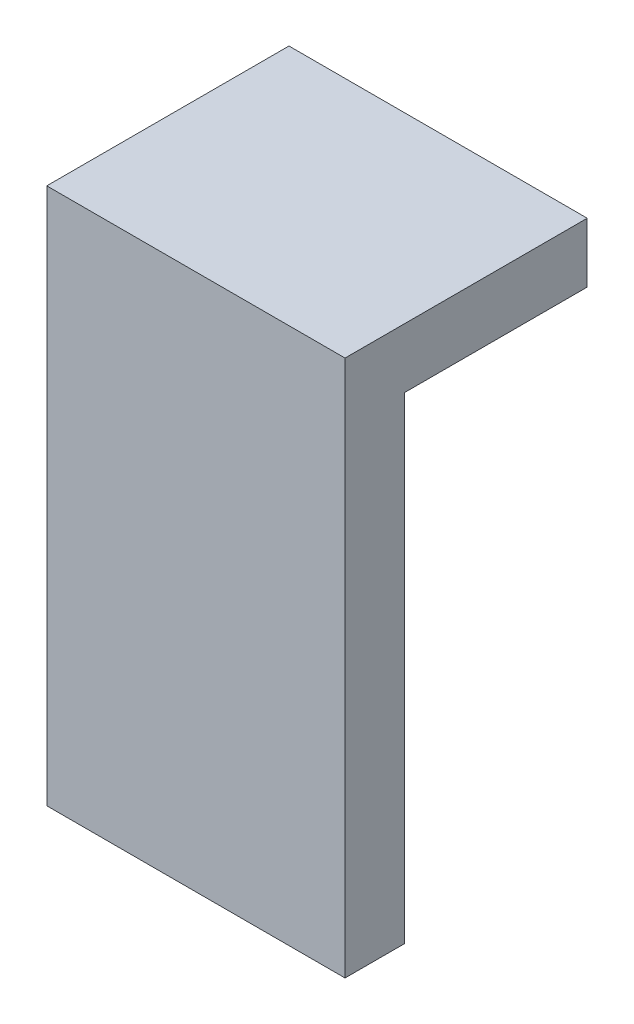
ISO-10303-21;
HEADER;
FILE_DESCRIPTION(('STEP AP214'),'2;1');
FILE_NAME('part.step','',(''),(''),'','','');
FILE_SCHEMA(('AUTOMOTIVE_DESIGN { 1 0 10303 214 1 1 1 1 }'));
ENDSEC;
DATA;
#1=APPLICATION_CONTEXT('core data for automotive mechanical design processes');
#2=APPLICATION_PROTOCOL_DEFINITION('international standard','automotive_design',2000,#1);
#3=PRODUCT_CONTEXT('',#1,'mechanical');
#4=PRODUCT('Part','Part','',(#3));
#5=PRODUCT_RELATED_PRODUCT_CATEGORY('part','',(#4));
#6=PRODUCT_DEFINITION_FORMATION('','',#4);
#7=PRODUCT_DEFINITION_CONTEXT('part definition',#1,'design');
#8=PRODUCT_DEFINITION('design','',#6,#7);
#9=PRODUCT_DEFINITION_SHAPE('','',#8);
#10=(LENGTH_UNIT() NAMED_UNIT(*) SI_UNIT(.MILLI.,.METRE.));
#11=(NAMED_UNIT(*) PLANE_ANGLE_UNIT() SI_UNIT($,.RADIAN.));
#12=(NAMED_UNIT(*) SI_UNIT($,.STERADIAN.) SOLID_ANGLE_UNIT());
#13=UNCERTAINTY_MEASURE_WITH_UNIT(LENGTH_MEASURE(1.E-05),#10,'distance_accuracy_value','');
#14=(GEOMETRIC_REPRESENTATION_CONTEXT(3) GLOBAL_UNCERTAINTY_ASSIGNED_CONTEXT((#13)) GLOBAL_UNIT_ASSIGNED_CONTEXT((#10,
#11,#12)) REPRESENTATION_CONTEXT('',''));
#15=CARTESIAN_POINT('',(0.,0.,0.));
#16=DIRECTION('',(0.,0.,1.));
#17=DIRECTION('',(1.,0.,0.));
#18=AXIS2_PLACEMENT_3D('',#15,#16,#17);
#19=CARTESIAN_POINT('',(-16.7771981451197,20.4309707447742,-0.0549988670939828));
#20=CARTESIAN_POINT('',(-16.7771981451197,20.4309707395288,0.00500113290601699));
#21=CARTESIAN_POINT('',(-16.4771981451197,20.4309707316608,-0.0549988670939839));
#22=CARTESIAN_POINT('',(-16.4771981451197,20.4309707264154,0.00500113290601585));
#23=(BOUNDED_SURFACE() B_SPLINE_SURFACE(1,1,((#19,#20),(#21,#22)),.UNSPECIFIED.,.F.,.F.,
.F.) B_SPLINE_SURFACE_WITH_KNOTS((2,2),(2,2),(-2.5E-05,0.000275),(-5.5E-05,5.E-06),
.UNSPECIFIED.) GEOMETRIC_REPRESENTATION_ITEM() RATIONAL_B_SPLINE_SURFACE(((1.,1.),(1.,1.))) REPRESENTATION_ITEM('') SURFACE());
#24=CARTESIAN_POINT('',(-16.5021981451197,20.4309707279453,1.13290601596108E-06));
#25=CARTESIAN_POINT('',(-16.7521981451197,20.4309707388731,1.13290601691642E-06));
#26=(BOUNDED_CURVE() B_SPLINE_CURVE(1,(#24,#25),.UNSPECIFIED.,.F.,
.F.) B_SPLINE_CURVE_WITH_KNOTS((2,2),(0.,0.00025),
.UNSPECIFIED.) CURVE() GEOMETRIC_REPRESENTATION_ITEM() RATIONAL_B_SPLINE_CURVE((1.,1.)) REPRESENTATION_ITEM(''));
#27=CARTESIAN_POINT('',(-16.5021981451197,20.4309707279453,1.13290601596108E-06));
#28=VERTEX_POINT('',#27);
#29=CARTESIAN_POINT('',(-16.7521981451197,20.4309707388732,1.13290601682844E-06));
#30=VERTEX_POINT('',#29);
#31=EDGE_CURVE('E147',#28,#30,#26,.T.);
#32=CARTESIAN_POINT('',(-16.7521981451197,20.4309707388732,1.13290601682844E-06));
#33=CARTESIAN_POINT('',(-16.7521981451197,20.4309707432443,-0.0499988670939829));
#34=(BOUNDED_CURVE() B_SPLINE_CURVE(1,(#32,#33),.UNSPECIFIED.,.F.,
.F.) B_SPLINE_CURVE_WITH_KNOTS((2,2),(0.,5.E-05),
.UNSPECIFIED.) CURVE() GEOMETRIC_REPRESENTATION_ITEM() RATIONAL_B_SPLINE_CURVE((1.,1.)) REPRESENTATION_ITEM(''));
#35=CARTESIAN_POINT('',(-16.7521981451197,20.4309707432443,-0.0499988670939829));
#36=VERTEX_POINT('',#35);
#37=EDGE_CURVE('E32',#30,#36,#34,.T.);
#38=CARTESIAN_POINT('',(-16.5021981451197,20.4309707323165,-0.0499988670939837));
#39=CARTESIAN_POINT('',(-16.7521981451197,20.4309707432443,-0.0499988670939827));
#40=(BOUNDED_CURVE() B_SPLINE_CURVE(1,(#38,#39),.UNSPECIFIED.,.F.,
.F.) B_SPLINE_CURVE_WITH_KNOTS((2,2),(0.,0.00025),
.UNSPECIFIED.) CURVE() GEOMETRIC_REPRESENTATION_ITEM() RATIONAL_B_SPLINE_CURVE((1.,1.)) REPRESENTATION_ITEM(''));
#41=CARTESIAN_POINT('',(-16.5021981451197,20.4309707323165,-0.0499988670939837));
#42=VERTEX_POINT('',#41);
#43=EDGE_CURVE('E127',#42,#36,#40,.T.);
#44=CARTESIAN_POINT('',(-16.5021981451197,20.4309707279453,1.13290601596108E-06));
#45=CARTESIAN_POINT('',(-16.5021981451197,20.4309707323164,-0.0499988670939837));
#46=(BOUNDED_CURVE() B_SPLINE_CURVE(1,(#44,#45),.UNSPECIFIED.,.F.,
.F.) B_SPLINE_CURVE_WITH_KNOTS((2,2),(0.,5.E-05),
.UNSPECIFIED.) CURVE() GEOMETRIC_REPRESENTATION_ITEM() RATIONAL_B_SPLINE_CURVE((1.,1.)) REPRESENTATION_ITEM(''));
#47=EDGE_CURVE('E11',#28,#42,#46,.T.);
#48=ORIENTED_EDGE('',*,*,#31,.T.);
#49=ORIENTED_EDGE('',*,*,#37,.T.);
#50=ORIENTED_EDGE('',*,*,#43,.F.);
#51=ORIENTED_EDGE('',*,*,#47,.F.);
#52=EDGE_LOOP('',(#48,#49,#50,#51));
#53=FACE_BOUND('',#52,.T.);
#54=ADVANCED_FACE('F17',(#53),#23,.T.);
#55=CARTESIAN_POINT('',(-16.5021981470867,20.3859707474668,-0.223298871028006));
#56=CARTESIAN_POINT('',(-16.5021981470867,20.3859707261706,0.0203011289719929));
#57=CARTESIAN_POINT('',(-16.5021981234826,20.9259707474669,-0.22329882381973));
#58=CARTESIAN_POINT('',(-16.5021981234826,20.9259707261707,0.0203011761802692));
#59=(BOUNDED_SURFACE() B_SPLINE_SURFACE(1,1,((#55,#56),(#57,#58)),.UNSPECIFIED.,.F.,.F.,
.F.) B_SPLINE_SURFACE_WITH_KNOTS((2,2),(2,2),(-4.50000000000996E-05,0.000495000000000013),
(-0.0002233,2.03E-05),
.UNSPECIFIED.) GEOMETRIC_REPRESENTATION_ITEM() RATIONAL_B_SPLINE_SURFACE(((1.,1.),(1.,1.))) REPRESENTATION_ITEM('') SURFACE());
#60=CARTESIAN_POINT('',(-16.5021981276352,20.8309707323165,-0.0499988321248901));
#61=CARTESIAN_POINT('',(-16.5021981451197,20.4309707323165,-0.0499988670939837));
#62=(BOUNDED_CURVE() B_SPLINE_CURVE(1,(#60,#61),.UNSPECIFIED.,.F.,
.F.) B_SPLINE_CURVE_WITH_KNOTS((2,2),(4.99999999999989E-05,0.00045),
.UNSPECIFIED.) CURVE() GEOMETRIC_REPRESENTATION_ITEM() RATIONAL_B_SPLINE_CURVE((1.,1.)) REPRESENTATION_ITEM(''));
#63=CARTESIAN_POINT('',(-16.5021981276352,20.8309707323165,-0.0499988321248901));
#64=VERTEX_POINT('',#63);
#65=EDGE_CURVE('E155',#64,#42,#62,.T.);
#66=CARTESIAN_POINT('',(-16.5021981276352,20.8309707323165,-0.0499988321248901));
#67=CARTESIAN_POINT('',(-16.5021981276352,20.8309707456922,-0.202998832124889));
#68=(BOUNDED_CURVE() B_SPLINE_CURVE(1,(#66,#67),.UNSPECIFIED.,.F.,
.F.) B_SPLINE_CURVE_WITH_KNOTS((2,2),(5.E-05,0.000203),
.UNSPECIFIED.) CURVE() GEOMETRIC_REPRESENTATION_ITEM() RATIONAL_B_SPLINE_CURVE((1.,1.)) REPRESENTATION_ITEM(''));
#69=CARTESIAN_POINT('',(-16.5021981276352,20.8309707456922,-0.202998832124889));
#70=VERTEX_POINT('',#69);
#71=EDGE_CURVE('E88',#64,#70,#68,.T.);
#72=CARTESIAN_POINT('',(-16.5021981276352,20.8309707456922,-0.20299883212489));
#73=CARTESIAN_POINT('',(-16.5021981254496,20.8809707456922,-0.202998827753753));
#74=(BOUNDED_CURVE() B_SPLINE_CURVE(1,(#72,#73),.UNSPECIFIED.,.F.,
.F.) B_SPLINE_CURVE_WITH_KNOTS((2,2),(-4.99999999999989E-05,0.),
.UNSPECIFIED.) CURVE() GEOMETRIC_REPRESENTATION_ITEM() RATIONAL_B_SPLINE_CURVE((1.,1.)) REPRESENTATION_ITEM(''));
#75=CARTESIAN_POINT('',(-16.5021981254496,20.8809707456922,-0.202998827753753));
#76=VERTEX_POINT('',#75);
#77=EDGE_CURVE('E99',#70,#76,#74,.T.);
#78=CARTESIAN_POINT('',(-16.5021981254496,20.8809707279453,1.17224624625323E-06));
#79=CARTESIAN_POINT('',(-16.5021981254496,20.8809707456921,-0.202998827753753));
#80=(BOUNDED_CURVE() B_SPLINE_CURVE(1,(#78,#79),.UNSPECIFIED.,.F.,
.F.) B_SPLINE_CURVE_WITH_KNOTS((2,2),(0.,0.000203),
.UNSPECIFIED.) CURVE() GEOMETRIC_REPRESENTATION_ITEM() RATIONAL_B_SPLINE_CURVE((1.,1.)) REPRESENTATION_ITEM(''));
#81=CARTESIAN_POINT('',(-16.5021981254496,20.8809707279453,1.17224624625323E-06));
#82=VERTEX_POINT('',#81);
#83=EDGE_CURVE('E89',#82,#76,#80,.T.);
#84=CARTESIAN_POINT('',(-16.5021981254496,20.8809707279453,1.17224624625323E-06));
#85=CARTESIAN_POINT('',(-16.5021981451197,20.4309707279453,1.13290601597982E-06));
#86=(BOUNDED_CURVE() B_SPLINE_CURVE(1,(#84,#85),.UNSPECIFIED.,.F.,
.F.) B_SPLINE_CURVE_WITH_KNOTS((2,2),(0.,0.00045),
.UNSPECIFIED.) CURVE() GEOMETRIC_REPRESENTATION_ITEM() RATIONAL_B_SPLINE_CURVE((1.,1.)) REPRESENTATION_ITEM(''));
#87=EDGE_CURVE('E162',#82,#28,#86,.T.);
#88=ORIENTED_EDGE('',*,*,#47,.T.);
#89=ORIENTED_EDGE('',*,*,#65,.F.);
#90=ORIENTED_EDGE('',*,*,#71,.T.);
#91=ORIENTED_EDGE('',*,*,#77,.T.);
#92=ORIENTED_EDGE('',*,*,#83,.F.);
#93=ORIENTED_EDGE('',*,*,#87,.T.);
#94=EDGE_LOOP('',(#88,#89,#90,#91,#92,#93));
#95=FACE_BOUND('',#94,.T.);
#96=ADVANCED_FACE('F19',(#95),#59,.T.);
#97=CARTESIAN_POINT('',(-16.7521981234826,20.9259707583947,-0.223298823819729));
#98=CARTESIAN_POINT('',(-16.7521981234826,20.9259707370985,0.0203011761802701));
#99=CARTESIAN_POINT('',(-16.7521981470867,20.3859707583947,-0.223298871028006));
#100=CARTESIAN_POINT('',(-16.7521981470867,20.3859707370985,0.0203011289719938));
#101=(BOUNDED_SURFACE() B_SPLINE_SURFACE(1,1,((#97,#98),(#99,#100)),.UNSPECIFIED.,.F.,.F.,
.F.) B_SPLINE_SURFACE_WITH_KNOTS((2,2),(2,2),(-4.50000000000373E-05,0.000495000000000012),
(-0.0002233,2.03E-05),
.UNSPECIFIED.) GEOMETRIC_REPRESENTATION_ITEM() RATIONAL_B_SPLINE_SURFACE(((1.,1.),(1.,1.))) REPRESENTATION_ITEM('') SURFACE());
#102=CARTESIAN_POINT('',(-16.7521981451197,20.4309707388732,1.13290601682844E-06));
#103=CARTESIAN_POINT('',(-16.7521981254496,20.8809707388732,1.17224624710185E-06));
#104=(BOUNDED_CURVE() B_SPLINE_CURVE(1,(#102,#103),.UNSPECIFIED.,.F.,
.F.) B_SPLINE_CURVE_WITH_KNOTS((2,2),(0.,0.00045),
.UNSPECIFIED.) CURVE() GEOMETRIC_REPRESENTATION_ITEM() RATIONAL_B_SPLINE_CURVE((1.,1.)) REPRESENTATION_ITEM(''));
#105=CARTESIAN_POINT('',(-16.7521981254497,20.8809707388732,1.17224624712059E-06));
#106=VERTEX_POINT('',#105);
#107=EDGE_CURVE('E83',#30,#106,#104,.T.);
#108=CARTESIAN_POINT('',(-16.7521981254497,20.8809707388732,1.17224624712059E-06));
#109=CARTESIAN_POINT('',(-16.7521981254497,20.88097075662,-0.202998827753752));
#110=(BOUNDED_CURVE() B_SPLINE_CURVE(1,(#108,#109),.UNSPECIFIED.,.F.,
.F.) B_SPLINE_CURVE_WITH_KNOTS((2,2),(0.,0.000203),
.UNSPECIFIED.) CURVE() GEOMETRIC_REPRESENTATION_ITEM() RATIONAL_B_SPLINE_CURVE((1.,1.)) REPRESENTATION_ITEM(''));
#111=CARTESIAN_POINT('',(-16.7521981254497,20.88097075662,-0.202998827753752));
#112=VERTEX_POINT('',#111);
#113=EDGE_CURVE('E76',#106,#112,#110,.T.);
#114=CARTESIAN_POINT('',(-16.7521981276352,20.83097075662,-0.202998832124889));
#115=CARTESIAN_POINT('',(-16.7521981254496,20.88097075662,-0.202998827753752));
#116=(BOUNDED_CURVE() B_SPLINE_CURVE(1,(#114,#115),.UNSPECIFIED.,.F.,
.F.) B_SPLINE_CURVE_WITH_KNOTS((2,2),(0.,4.99999999999989E-05),
.UNSPECIFIED.) CURVE() GEOMETRIC_REPRESENTATION_ITEM() RATIONAL_B_SPLINE_CURVE((1.,1.)) REPRESENTATION_ITEM(''));
#117=CARTESIAN_POINT('',(-16.7521981276352,20.83097075662,-0.202998832124889));
#118=VERTEX_POINT('',#117);
#119=EDGE_CURVE('E80',#118,#112,#116,.T.);
#120=CARTESIAN_POINT('',(-16.7521981276352,20.83097075662,-0.202998832124889));
#121=CARTESIAN_POINT('',(-16.7521981276352,20.8309707432443,-0.0499988321248893));
#122=(BOUNDED_CURVE() B_SPLINE_CURVE(1,(#120,#121),.UNSPECIFIED.,.F.,
.F.) B_SPLINE_CURVE_WITH_KNOTS((2,2),(-0.000203,-5.E-05),
.UNSPECIFIED.) CURVE() GEOMETRIC_REPRESENTATION_ITEM() RATIONAL_B_SPLINE_CURVE((1.,1.)) REPRESENTATION_ITEM(''));
#123=CARTESIAN_POINT('',(-16.7521981276352,20.8309707432443,-0.0499988321248893));
#124=VERTEX_POINT('',#123);
#125=EDGE_CURVE('E23',#118,#124,#122,.T.);
#126=CARTESIAN_POINT('',(-16.7521981451197,20.4309707432443,-0.0499988670939829));
#127=CARTESIAN_POINT('',(-16.7521981276351,20.8309707432443,-0.0499988321248893));
#128=(BOUNDED_CURVE() B_SPLINE_CURVE(1,(#126,#127),.UNSPECIFIED.,.F.,
.F.) B_SPLINE_CURVE_WITH_KNOTS((2,2),(0.,0.0004),
.UNSPECIFIED.) CURVE() GEOMETRIC_REPRESENTATION_ITEM() RATIONAL_B_SPLINE_CURVE((1.,1.)) REPRESENTATION_ITEM(''));
#129=EDGE_CURVE('E55',#36,#124,#128,.T.);
#130=ORIENTED_EDGE('',*,*,#107,.T.);
#131=ORIENTED_EDGE('',*,*,#113,.T.);
#132=ORIENTED_EDGE('',*,*,#119,.F.);
#133=ORIENTED_EDGE('',*,*,#125,.T.);
#134=ORIENTED_EDGE('',*,*,#129,.F.);
#135=ORIENTED_EDGE('',*,*,#37,.F.);
#136=EDGE_LOOP('',(#130,#131,#132,#133,#134,#135));
#137=FACE_BOUND('',#136,.T.);
#138=ADVANCED_FACE('F78',(#137),#101,.T.);
#139=CARTESIAN_POINT('',(-16.4771981470867,20.3859707268525,1.12897199285695E-06));
#140=CARTESIAN_POINT('',(-16.7771981470868,20.3859707399659,1.12897199400336E-06));
#141=CARTESIAN_POINT('',(-16.4771981234825,20.9259707268526,1.17618026918504E-06));
#142=CARTESIAN_POINT('',(-16.7771981234827,20.925970739966,1.17618027033145E-06));
#143=(BOUNDED_SURFACE() B_SPLINE_SURFACE(1,1,((#139,#140),(#141,#142)),.UNSPECIFIED.,.F.,.F.,
.F.) B_SPLINE_SURFACE_WITH_KNOTS((2,2),(2,2),(-0.000495000000000009,4.50000000000652E-05),
(-2.50000000000402E-05,0.00027500000000011),
.UNSPECIFIED.) GEOMETRIC_REPRESENTATION_ITEM() RATIONAL_B_SPLINE_SURFACE(((1.,1.),(1.,1.))) REPRESENTATION_ITEM('') SURFACE());
#144=CARTESIAN_POINT('',(-16.7521981254497,20.8809707388732,1.17224624712059E-06));
#145=CARTESIAN_POINT('',(-16.5021981254496,20.8809707279454,1.17224624616525E-06));
#146=(BOUNDED_CURVE() B_SPLINE_CURVE(1,(#144,#145),.UNSPECIFIED.,.F.,
.F.) B_SPLINE_CURVE_WITH_KNOTS((2,2),(0.,0.000250000000000097),
.UNSPECIFIED.) CURVE() GEOMETRIC_REPRESENTATION_ITEM() RATIONAL_B_SPLINE_CURVE((1.,1.)) REPRESENTATION_ITEM(''));
#147=EDGE_CURVE('E115',#106,#82,#146,.T.);
#148=ORIENTED_EDGE('',*,*,#87,.F.);
#149=ORIENTED_EDGE('',*,*,#147,.F.);
#150=ORIENTED_EDGE('',*,*,#107,.F.);
#151=ORIENTED_EDGE('',*,*,#31,.F.);
#152=EDGE_LOOP('',(#148,#149,#150,#151));
#153=FACE_BOUND('',#152,.T.);
#154=ADVANCED_FACE('F342',(#153),#143,.T.);
#155=CARTESIAN_POINT('',(-16.4771981258867,20.8709707312237,-0.0499988286279808));
#156=CARTESIAN_POINT('',(-16.7771981258868,20.8709707443371,-0.0499988286279797));
#157=CARTESIAN_POINT('',(-16.4771981468681,20.3909707312237,-0.0499988705908931));
#158=CARTESIAN_POINT('',(-16.7771981468682,20.3909707443371,-0.049998870590892));
#159=(BOUNDED_SURFACE() B_SPLINE_SURFACE(1,1,((#155,#156),(#157,#158)),.UNSPECIFIED.,.F.,.F.,
.F.) B_SPLINE_SURFACE_WITH_KNOTS((2,2),(2,2),(-0.000490000000000053,-9.99999999999298E-06),
(-2.50000000000336E-05,0.000275000000000036),
.UNSPECIFIED.) GEOMETRIC_REPRESENTATION_ITEM() RATIONAL_B_SPLINE_SURFACE(((1.,1.),(1.,1.))) REPRESENTATION_ITEM('') SURFACE());
#160=CARTESIAN_POINT('',(-16.7521981276352,20.8309707432443,-0.0499988321248891));
#161=CARTESIAN_POINT('',(-16.5021981276352,20.8309707323165,-0.0499988321248901));
#162=(BOUNDED_CURVE() B_SPLINE_CURVE(1,(#160,#161),.UNSPECIFIED.,.F.,
.F.) B_SPLINE_CURVE_WITH_KNOTS((2,2),(-0.00025,0.),
.UNSPECIFIED.) CURVE() GEOMETRIC_REPRESENTATION_ITEM() RATIONAL_B_SPLINE_CURVE((1.,1.)) REPRESENTATION_ITEM(''));
#163=EDGE_CURVE('E119',#124,#64,#162,.T.);
#164=ORIENTED_EDGE('',*,*,#43,.T.);
#165=ORIENTED_EDGE('',*,*,#129,.T.);
#166=ORIENTED_EDGE('',*,*,#163,.T.);
#167=ORIENTED_EDGE('',*,*,#65,.T.);
#168=EDGE_LOOP('',(#164,#165,#166,#167));
#169=FACE_BOUND('',#168,.T.);
#170=ADVANCED_FACE('F331',(#169),#159,.T.);
#171=CARTESIAN_POINT('',(-16.4771981276352,20.830970745937,-0.21829883212489));
#172=CARTESIAN_POINT('',(-16.7771981276352,20.8309707590504,-0.218298832124889));
#173=CARTESIAN_POINT('',(-16.4771981276352,20.8309707298862,-0.0346988321248902));
#174=CARTESIAN_POINT('',(-16.7771981276352,20.8309707429996,-0.034698832124889));
#175=(BOUNDED_SURFACE() B_SPLINE_SURFACE(1,1,((#171,#172),(#173,#174)),.UNSPECIFIED.,.F.,.F.,
.F.) B_SPLINE_SURFACE_WITH_KNOTS((2,2),(2,2),(-0.0002183,-3.47E-05),(-2.50000000000004E-05,
0.000275000000000004),
.UNSPECIFIED.) GEOMETRIC_REPRESENTATION_ITEM() RATIONAL_B_SPLINE_SURFACE(((1.,1.),(1.,1.))) REPRESENTATION_ITEM('') SURFACE());
#176=CARTESIAN_POINT('',(-16.5021981276352,20.8309707456922,-0.202998832124889));
#177=CARTESIAN_POINT('',(-16.7521981276352,20.83097075662,-0.202998832124888));
#178=(BOUNDED_CURVE() B_SPLINE_CURVE(1,(#176,#177),.UNSPECIFIED.,.F.,
.F.) B_SPLINE_CURVE_WITH_KNOTS((2,2),(0.,0.00025),
.UNSPECIFIED.) CURVE() GEOMETRIC_REPRESENTATION_ITEM() RATIONAL_B_SPLINE_CURVE((1.,1.)) REPRESENTATION_ITEM(''));
#179=EDGE_CURVE('E103',#70,#118,#178,.T.);
#180=ORIENTED_EDGE('',*,*,#71,.F.);
#181=ORIENTED_EDGE('',*,*,#163,.F.);
#182=ORIENTED_EDGE('',*,*,#125,.F.);
#183=ORIENTED_EDGE('',*,*,#179,.F.);
#184=EDGE_LOOP('',(#180,#181,#182,#183));
#185=FACE_BOUND('',#184,.T.);
#186=ADVANCED_FACE('F222',(#185),#175,.T.);
#187=CARTESIAN_POINT('',(-16.4771981254496,20.8809707463741,-0.223298827753753));
#188=CARTESIAN_POINT('',(-16.4771981254496,20.8809707250779,0.0203011722462461));
#189=CARTESIAN_POINT('',(-16.7771981254497,20.8809707594875,-0.223298827753752));
#190=CARTESIAN_POINT('',(-16.7771981254497,20.8809707381913,0.0203011722462472));
#191=(BOUNDED_SURFACE() B_SPLINE_SURFACE(1,1,((#187,#188),(#189,#190)),.UNSPECIFIED.,.F.,.F.,
.F.) B_SPLINE_SURFACE_WITH_KNOTS((2,2),(2,2),(-2.50000000000097E-05,0.000275000000000107),
(-0.0002233,2.03E-05),
.UNSPECIFIED.) GEOMETRIC_REPRESENTATION_ITEM() RATIONAL_B_SPLINE_SURFACE(((1.,1.),(1.,1.))) REPRESENTATION_ITEM('') SURFACE());
#192=CARTESIAN_POINT('',(-16.5021981254496,20.8809707456922,-0.202998827753753));
#193=CARTESIAN_POINT('',(-16.7521981254497,20.88097075662,-0.202998827753752));
#194=(BOUNDED_CURVE() B_SPLINE_CURVE(1,(#192,#193),.UNSPECIFIED.,.F.,
.F.) B_SPLINE_CURVE_WITH_KNOTS((2,2),(-0.000250000000000097,0.),
.UNSPECIFIED.) CURVE() GEOMETRIC_REPRESENTATION_ITEM() RATIONAL_B_SPLINE_CURVE((1.,1.)) REPRESENTATION_ITEM(''));
#195=EDGE_CURVE('E92',#76,#112,#194,.T.);
#196=ORIENTED_EDGE('',*,*,#147,.T.);
#197=ORIENTED_EDGE('',*,*,#83,.T.);
#198=ORIENTED_EDGE('',*,*,#195,.T.);
#199=ORIENTED_EDGE('',*,*,#113,.F.);
#200=EDGE_LOOP('',(#196,#197,#198,#199));
#201=FACE_BOUND('',#200,.T.);
#202=ADVANCED_FACE('F93',(#201),#191,.T.);
#203=CARTESIAN_POINT('',(-16.7771981252312,20.8859707577128,-0.202998827316638));
#204=CARTESIAN_POINT('',(-16.7771981278538,20.8259707577128,-0.202998832562002));
#205=CARTESIAN_POINT('',(-16.477198125231,20.8859707445994,-0.202998827316639));
#206=CARTESIAN_POINT('',(-16.4771981278537,20.8259707445994,-0.202998832562003));
#207=(BOUNDED_SURFACE() B_SPLINE_SURFACE(1,1,((#203,#204),(#205,#206)),.UNSPECIFIED.,.F.,.F.,
.F.) B_SPLINE_SURFACE_WITH_KNOTS((2,2),(2,2),(-2.500000000004E-05,0.00027500000000008),
(-5.50000000000064E-05,5.00000000005357E-06),
.UNSPECIFIED.) GEOMETRIC_REPRESENTATION_ITEM() RATIONAL_B_SPLINE_SURFACE(((1.,1.),(1.,1.))) REPRESENTATION_ITEM('') SURFACE());
#208=ORIENTED_EDGE('',*,*,#179,.T.);
#209=ORIENTED_EDGE('',*,*,#119,.T.);
#210=ORIENTED_EDGE('',*,*,#195,.F.);
#211=ORIENTED_EDGE('',*,*,#77,.F.);
#212=EDGE_LOOP('',(#208,#209,#210,#211));
#213=FACE_BOUND('',#212,.T.);
#214=ADVANCED_FACE('F101',(#213),#207,.T.);
#215=CLOSED_SHELL('',(#54,#96,#138,#154,#170,#186,#202,#214));
#216=MANIFOLD_SOLID_BREP('B1',#215);
#217=ADVANCED_BREP_SHAPE_REPRESENTATION('',(#18,#216),#14);
#218=SHAPE_DEFINITION_REPRESENTATION(#9,#217);
ENDSEC;
END-ISO-10303-21;
